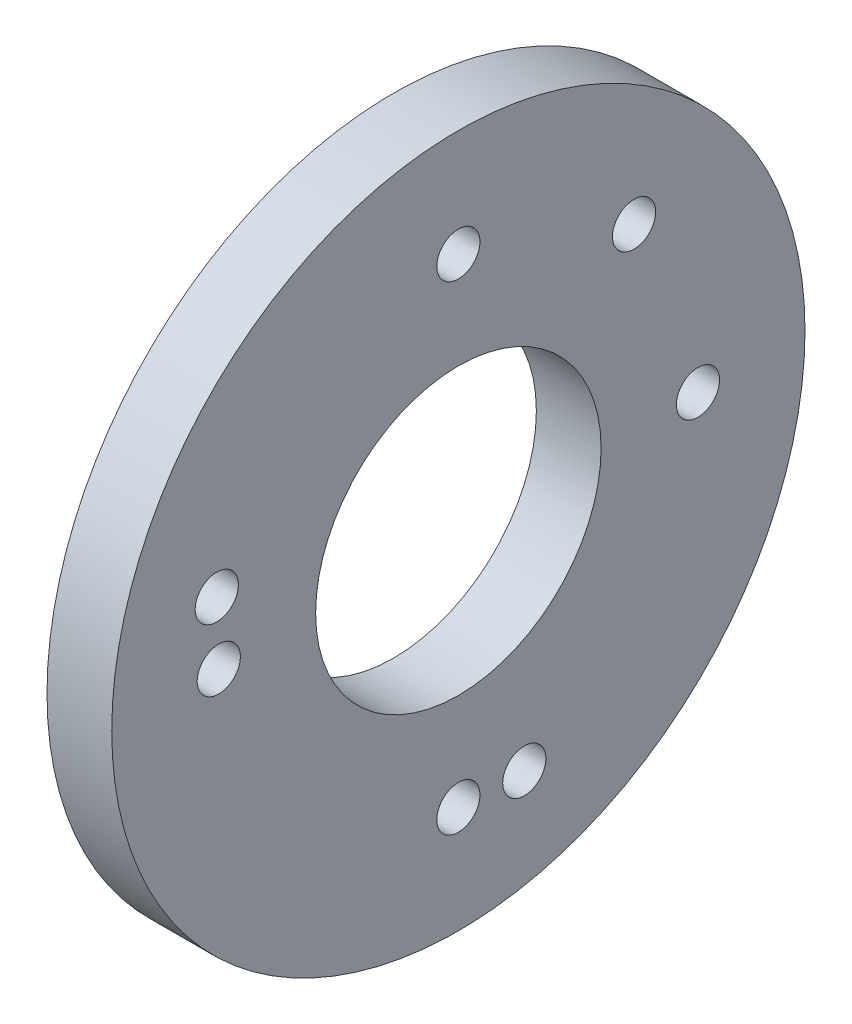
ISO-10303-21;
HEADER;
FILE_DESCRIPTION(('STEP AP214'),'2;1');
FILE_NAME('part.step','',(''),(''),'','','');
FILE_SCHEMA(('AUTOMOTIVE_DESIGN { 1 0 10303 214 1 1 1 1 }'));
ENDSEC;
DATA;
#1=APPLICATION_CONTEXT('core data for automotive mechanical design processes');
#2=APPLICATION_PROTOCOL_DEFINITION('international standard','automotive_design',2000,#1);
#3=PRODUCT_CONTEXT('',#1,'mechanical');
#4=PRODUCT('Part','Part','',(#3));
#5=PRODUCT_RELATED_PRODUCT_CATEGORY('part','',(#4));
#6=PRODUCT_DEFINITION_FORMATION('','',#4);
#7=PRODUCT_DEFINITION_CONTEXT('part definition',#1,'design');
#8=PRODUCT_DEFINITION('design','',#6,#7);
#9=PRODUCT_DEFINITION_SHAPE('','',#8);
#10=(LENGTH_UNIT() NAMED_UNIT(*) SI_UNIT(.MILLI.,.METRE.));
#11=(NAMED_UNIT(*) PLANE_ANGLE_UNIT() SI_UNIT($,.RADIAN.));
#12=(NAMED_UNIT(*) SI_UNIT($,.STERADIAN.) SOLID_ANGLE_UNIT());
#13=UNCERTAINTY_MEASURE_WITH_UNIT(LENGTH_MEASURE(1.E-05),#10,'distance_accuracy_value','');
#14=(GEOMETRIC_REPRESENTATION_CONTEXT(3) GLOBAL_UNCERTAINTY_ASSIGNED_CONTEXT((#13)) GLOBAL_UNIT_ASSIGNED_CONTEXT((#10,
#11,#12)) REPRESENTATION_CONTEXT('',''));
#15=CARTESIAN_POINT('',(0.,0.,0.));
#16=DIRECTION('',(0.,0.,1.));
#17=DIRECTION('',(1.,0.,0.));
#18=AXIS2_PLACEMENT_3D('',#15,#16,#17);
#19=CARTESIAN_POINT('',(0.,0.,0.));
#20=DIRECTION('',(1.,0.,0.));
#21=DIRECTION('',(0.,1.,0.));
#22=AXIS2_PLACEMENT_3D('',#19,#20,#21);
#23=PLANE('',#22);
#24=CARTESIAN_POINT('',(0.,23.5,0.));
#25=DIRECTION('',(1.,0.,0.));
#26=DIRECTION('',(0.,1.,0.));
#27=AXIS2_PLACEMENT_3D('',#24,#25,#26);
#28=CIRCLE('',#27,2.117);
#29=CARTESIAN_POINT('',(0.,21.383,0.));
#30=VERTEX_POINT('',#29);
#31=EDGE_CURVE('E136',#30,#30,#28,.T.);
#32=ORIENTED_EDGE('',*,*,#31,.T.);
#33=EDGE_LOOP('',(#32));
#34=FACE_BOUND('',#33,.T.);
#35=CARTESIAN_POINT('',(0.,0.,23.5));
#36=DIRECTION('',(1.,0.,0.));
#37=DIRECTION('',(0.,0.,1.));
#38=AXIS2_PLACEMENT_3D('',#35,#36,#37);
#39=CIRCLE('',#38,2.117);
#40=CARTESIAN_POINT('',(0.,0.,21.383));
#41=VERTEX_POINT('',#40);
#42=EDGE_CURVE('E142',#41,#41,#39,.T.);
#43=ORIENTED_EDGE('',*,*,#42,.T.);
#44=EDGE_LOOP('',(#43));
#45=FACE_BOUND('',#44,.T.);
#46=CARTESIAN_POINT('',(0.,-23.5,0.));
#47=DIRECTION('',(1.,0.,0.));
#48=DIRECTION('',(0.,-1.,0.));
#49=AXIS2_PLACEMENT_3D('',#46,#47,#48);
#50=CIRCLE('',#49,2.117);
#51=CARTESIAN_POINT('',(0.,-21.383,0.));
#52=VERTEX_POINT('',#51);
#53=EDGE_CURVE('E137',#52,#52,#50,.T.);
#54=ORIENTED_EDGE('',*,*,#53,.T.);
#55=EDGE_LOOP('',(#54));
#56=FACE_BOUND('',#55,.T.);
#57=CARTESIAN_POINT('',(0.,0.,-23.5));
#58=DIRECTION('',(1.,0.,0.));
#59=DIRECTION('',(0.,0.,-1.));
#60=AXIS2_PLACEMENT_3D('',#57,#58,#59);
#61=CIRCLE('',#60,2.117);
#62=CARTESIAN_POINT('',(0.,0.,-21.383));
#63=VERTEX_POINT('',#62);
#64=EDGE_CURVE('E129',#63,#63,#61,.T.);
#65=ORIENTED_EDGE('',*,*,#64,.T.);
#66=EDGE_LOOP('',(#65));
#67=FACE_BOUND('',#66,.T.);
#68=CARTESIAN_POINT('',(0.,17.41511596039,-17.2326357846433));
#69=DIRECTION('',(1.,0.,0.));
#70=DIRECTION('',(0.,1.,0.));
#71=AXIS2_PLACEMENT_3D('',#68,#69,#70);
#72=CIRCLE('',#71,2.117);
#73=CARTESIAN_POINT('',(0.,15.29811596039,-17.2326357846433));
#74=VERTEX_POINT('',#73);
#75=EDGE_CURVE('E110',#74,#74,#72,.T.);
#76=ORIENTED_EDGE('',*,*,#75,.T.);
#77=EDGE_LOOP('',(#76));
#78=FACE_BOUND('',#77,.T.);
#79=CARTESIAN_POINT('',(0.,6.21634238347088,23.6982507238712));
#80=DIRECTION('',(1.,0.,0.));
#81=DIRECTION('',(0.,-0.5,0.866025403784439));
#82=AXIS2_PLACEMENT_3D('',#79,#80,#81);
#83=CIRCLE('',#82,2.117);
#84=CARTESIAN_POINT('',(0.,7.27484238347088,21.8648749440596));
#85=VERTEX_POINT('',#84);
#86=EDGE_CURVE('E259',#85,#85,#83,.T.);
#87=ORIENTED_EDGE('',*,*,#86,.T.);
#88=EDGE_LOOP('',(#87));
#89=FACE_BOUND('',#88,.T.);
#90=CARTESIAN_POINT('',(0.,-23.6314583438609,-6.46561493922793));
#91=DIRECTION('',(1.,0.,0.));
#92=DIRECTION('',(0.,-0.5,-0.866025403784438));
#93=AXIS2_PLACEMENT_3D('',#90,#91,#92);
#94=CIRCLE('',#93,2.117);
#95=CARTESIAN_POINT('',(0.,-22.5729583438609,-4.63223915941627));
#96=VERTEX_POINT('',#95);
#97=EDGE_CURVE('E127',#96,#96,#94,.T.);
#98=ORIENTED_EDGE('',*,*,#97,.T.);
#99=EDGE_LOOP('',(#98));
#100=FACE_BOUND('',#99,.T.);
#101=CARTESIAN_POINT('',(0.,0.,0.));
#102=DIRECTION('',(1.,0.,0.));
#103=DIRECTION('',(0.,1.,0.));
#104=AXIS2_PLACEMENT_3D('',#101,#102,#103);
#105=CIRCLE('',#104,14.);
#106=CARTESIAN_POINT('',(0.,-14.,0.));
#107=VERTEX_POINT('',#106);
#108=EDGE_CURVE('E189',#107,#107,#105,.T.);
#109=ORIENTED_EDGE('',*,*,#108,.T.);
#110=EDGE_LOOP('',(#109));
#111=FACE_BOUND('',#110,.T.);
#112=CARTESIAN_POINT('',(0.,0.,0.));
#113=DIRECTION('',(1.,0.,0.));
#114=DIRECTION('',(0.,0.,-1.));
#115=AXIS2_PLACEMENT_3D('',#112,#113,#114);
#116=CIRCLE('',#115,34.);
#117=CARTESIAN_POINT('',(0.,0.,34.));
#118=VERTEX_POINT('',#117);
#119=EDGE_CURVE('E11',#118,#118,#116,.T.);
#120=ORIENTED_EDGE('',*,*,#119,.F.);
#121=EDGE_LOOP('',(#120));
#122=FACE_BOUND('',#121,.T.);
#123=ADVANCED_FACE('F16',(#34,#45,#56,#67,#78,#89,#100,#111,#122),#23,.F.);
#124=CARTESIAN_POINT('',(6.35,0.,0.));
#125=DIRECTION('',(1.,0.,0.));
#126=DIRECTION('',(0.,1.,0.));
#127=AXIS2_PLACEMENT_3D('',#124,#125,#126);
#128=PLANE('',#127);
#129=CARTESIAN_POINT('',(6.35,23.5,0.));
#130=DIRECTION('',(-1.,0.,0.));
#131=DIRECTION('',(0.,1.,0.));
#132=AXIS2_PLACEMENT_3D('',#129,#130,#131);
#133=CIRCLE('',#132,2.117);
#134=CARTESIAN_POINT('',(6.35,21.383,0.));
#135=VERTEX_POINT('',#134);
#136=EDGE_CURVE('E145',#135,#135,#133,.T.);
#137=ORIENTED_EDGE('',*,*,#136,.T.);
#138=EDGE_LOOP('',(#137));
#139=FACE_BOUND('',#138,.T.);
#140=CARTESIAN_POINT('',(6.35,0.,23.5));
#141=DIRECTION('',(-1.,0.,0.));
#142=DIRECTION('',(0.,0.,1.));
#143=AXIS2_PLACEMENT_3D('',#140,#141,#142);
#144=CIRCLE('',#143,2.117);
#145=CARTESIAN_POINT('',(6.35,0.,21.383));
#146=VERTEX_POINT('',#145);
#147=EDGE_CURVE('E140',#146,#146,#144,.T.);
#148=ORIENTED_EDGE('',*,*,#147,.T.);
#149=EDGE_LOOP('',(#148));
#150=FACE_BOUND('',#149,.T.);
#151=CARTESIAN_POINT('',(6.35,-23.5,0.));
#152=DIRECTION('',(-1.,0.,0.));
#153=DIRECTION('',(0.,-1.,0.));
#154=AXIS2_PLACEMENT_3D('',#151,#152,#153);
#155=CIRCLE('',#154,2.117);
#156=CARTESIAN_POINT('',(6.35,-21.383,0.));
#157=VERTEX_POINT('',#156);
#158=EDGE_CURVE('E131',#157,#157,#155,.T.);
#159=ORIENTED_EDGE('',*,*,#158,.T.);
#160=EDGE_LOOP('',(#159));
#161=FACE_BOUND('',#160,.T.);
#162=CARTESIAN_POINT('',(6.35,0.,-23.5));
#163=DIRECTION('',(-1.,0.,0.));
#164=DIRECTION('',(0.,0.,-1.));
#165=AXIS2_PLACEMENT_3D('',#162,#163,#164);
#166=CIRCLE('',#165,2.117);
#167=CARTESIAN_POINT('',(6.35,0.,-21.383));
#168=VERTEX_POINT('',#167);
#169=EDGE_CURVE('E113',#168,#168,#166,.T.);
#170=ORIENTED_EDGE('',*,*,#169,.T.);
#171=EDGE_LOOP('',(#170));
#172=FACE_BOUND('',#171,.T.);
#173=CARTESIAN_POINT('',(6.35,17.41511596039,-17.2326357846433));
#174=DIRECTION('',(-1.,0.,0.));
#175=DIRECTION('',(0.,1.,0.));
#176=AXIS2_PLACEMENT_3D('',#173,#174,#175);
#177=CIRCLE('',#176,2.117);
#178=CARTESIAN_POINT('',(6.35,15.29811596039,-17.2326357846433));
#179=VERTEX_POINT('',#178);
#180=EDGE_CURVE('E123',#179,#179,#177,.T.);
#181=ORIENTED_EDGE('',*,*,#180,.T.);
#182=EDGE_LOOP('',(#181));
#183=FACE_BOUND('',#182,.T.);
#184=CARTESIAN_POINT('',(6.35,6.21634238347088,23.6982507238712));
#185=DIRECTION('',(-1.,0.,0.));
#186=DIRECTION('',(0.,-0.5,0.866025403784439));
#187=AXIS2_PLACEMENT_3D('',#184,#185,#186);
#188=CIRCLE('',#187,2.117);
#189=CARTESIAN_POINT('',(6.35,7.27484238347088,21.8648749440596));
#190=VERTEX_POINT('',#189);
#191=EDGE_CURVE('E147',#190,#190,#188,.T.);
#192=ORIENTED_EDGE('',*,*,#191,.T.);
#193=EDGE_LOOP('',(#192));
#194=FACE_BOUND('',#193,.T.);
#195=CARTESIAN_POINT('',(6.35,-23.6314583438609,-6.46561493922793));
#196=DIRECTION('',(-1.,0.,0.));
#197=DIRECTION('',(0.,-0.5,-0.866025403784439));
#198=AXIS2_PLACEMENT_3D('',#195,#196,#197);
#199=CIRCLE('',#198,2.117);
#200=CARTESIAN_POINT('',(6.35,-22.5729583438609,-4.63223915941627));
#201=VERTEX_POINT('',#200);
#202=EDGE_CURVE('E185',#201,#201,#199,.T.);
#203=ORIENTED_EDGE('',*,*,#202,.T.);
#204=EDGE_LOOP('',(#203));
#205=FACE_BOUND('',#204,.T.);
#206=CARTESIAN_POINT('',(6.35,0.,0.));
#207=DIRECTION('',(-1.,0.,0.));
#208=DIRECTION('',(0.,1.,0.));
#209=AXIS2_PLACEMENT_3D('',#206,#207,#208);
#210=CIRCLE('',#209,14.);
#211=CARTESIAN_POINT('',(6.35,-14.,0.));
#212=VERTEX_POINT('',#211);
#213=EDGE_CURVE('E190',#212,#212,#210,.T.);
#214=ORIENTED_EDGE('',*,*,#213,.T.);
#215=EDGE_LOOP('',(#214));
#216=FACE_BOUND('',#215,.T.);
#217=CARTESIAN_POINT('',(6.35,0.,0.));
#218=DIRECTION('',(1.,0.,0.));
#219=DIRECTION('',(0.,0.,-1.));
#220=AXIS2_PLACEMENT_3D('',#217,#218,#219);
#221=CIRCLE('',#220,34.);
#222=CARTESIAN_POINT('',(6.35,0.,34.));
#223=VERTEX_POINT('',#222);
#224=EDGE_CURVE('E132',#223,#223,#221,.T.);
#225=ORIENTED_EDGE('',*,*,#224,.T.);
#226=EDGE_LOOP('',(#225));
#227=FACE_BOUND('',#226,.T.);
#228=ADVANCED_FACE('F215',(#139,#150,#161,#172,#183,#194,#205,#216,#227),#128,.T.);
#229=CARTESIAN_POINT('',(0.,0.,0.));
#230=DIRECTION('',(1.,0.,0.));
#231=DIRECTION('',(0.,0.,-1.));
#232=AXIS2_PLACEMENT_3D('',#229,#230,#231);
#233=CYLINDRICAL_SURFACE('',#232,34.);
#234=ORIENTED_EDGE('',*,*,#224,.F.);
#235=DIRECTION('',(-1.,0.,0.));
#236=VECTOR('',#235,1.);
#237=CARTESIAN_POINT('',(0.,0.,34.));
#238=LINE('',#237,#236);
#239=EDGE_CURVE('E27',#223,#118,#238,.T.);
#240=ORIENTED_EDGE('',*,*,#239,.T.);
#241=ORIENTED_EDGE('',*,*,#119,.T.);
#242=ORIENTED_EDGE('',*,*,#239,.F.);
#243=EDGE_LOOP('',(#234,#240,#241,#242));
#244=FACE_BOUND('',#243,.T.);
#245=ADVANCED_FACE('F225',(#244),#233,.T.);
#246=CARTESIAN_POINT('',(2.8575,23.5,0.));
#247=DIRECTION('',(-1.,0.,0.));
#248=DIRECTION('',(0.,1.,0.));
#249=AXIS2_PLACEMENT_3D('',#246,#247,#248);
#250=CYLINDRICAL_SURFACE('',#249,2.117);
#251=ORIENTED_EDGE('',*,*,#136,.F.);
#252=DIRECTION('',(-1.,0.,0.));
#253=VECTOR('',#252,1.);
#254=CARTESIAN_POINT('',(2.8575,21.383,0.));
#255=LINE('',#254,#253);
#256=EDGE_CURVE('E155',#135,#30,#255,.T.);
#257=ORIENTED_EDGE('',*,*,#256,.T.);
#258=ORIENTED_EDGE('',*,*,#31,.F.);
#259=ORIENTED_EDGE('',*,*,#256,.F.);
#260=EDGE_LOOP('',(#251,#257,#258,#259));
#261=FACE_BOUND('',#260,.T.);
#262=ADVANCED_FACE('F236',(#261),#250,.F.);
#263=CARTESIAN_POINT('',(2.8575,0.,23.5));
#264=DIRECTION('',(-1.,0.,0.));
#265=DIRECTION('',(0.,0.,1.));
#266=AXIS2_PLACEMENT_3D('',#263,#264,#265);
#267=CYLINDRICAL_SURFACE('',#266,2.117);
#268=ORIENTED_EDGE('',*,*,#147,.F.);
#269=DIRECTION('',(-1.,0.,0.));
#270=VECTOR('',#269,1.);
#271=CARTESIAN_POINT('',(2.8575,0.,21.383));
#272=LINE('',#271,#270);
#273=EDGE_CURVE('E146',#146,#41,#272,.T.);
#274=ORIENTED_EDGE('',*,*,#273,.T.);
#275=ORIENTED_EDGE('',*,*,#42,.F.);
#276=ORIENTED_EDGE('',*,*,#273,.F.);
#277=EDGE_LOOP('',(#268,#274,#275,#276));
#278=FACE_BOUND('',#277,.T.);
#279=ADVANCED_FACE('F211',(#278),#267,.F.);
#280=CARTESIAN_POINT('',(2.8575,-23.5,0.));
#281=DIRECTION('',(-1.,0.,0.));
#282=DIRECTION('',(0.,-1.,0.));
#283=AXIS2_PLACEMENT_3D('',#280,#281,#282);
#284=CYLINDRICAL_SURFACE('',#283,2.117);
#285=ORIENTED_EDGE('',*,*,#158,.F.);
#286=DIRECTION('',(-1.,0.,0.));
#287=VECTOR('',#286,1.);
#288=CARTESIAN_POINT('',(2.8575,-21.383,0.));
#289=LINE('',#288,#287);
#290=EDGE_CURVE('E141',#157,#52,#289,.T.);
#291=ORIENTED_EDGE('',*,*,#290,.T.);
#292=ORIENTED_EDGE('',*,*,#53,.F.);
#293=ORIENTED_EDGE('',*,*,#290,.F.);
#294=EDGE_LOOP('',(#285,#291,#292,#293));
#295=FACE_BOUND('',#294,.T.);
#296=ADVANCED_FACE('F257',(#295),#284,.F.);
#297=CARTESIAN_POINT('',(2.8575,0.,-23.5));
#298=DIRECTION('',(-1.,0.,0.));
#299=DIRECTION('',(0.,0.,-1.));
#300=AXIS2_PLACEMENT_3D('',#297,#298,#299);
#301=CYLINDRICAL_SURFACE('',#300,2.117);
#302=ORIENTED_EDGE('',*,*,#169,.F.);
#303=DIRECTION('',(-1.,0.,0.));
#304=VECTOR('',#303,1.);
#305=CARTESIAN_POINT('',(2.8575,0.,-21.383));
#306=LINE('',#305,#304);
#307=EDGE_CURVE('E120',#168,#63,#306,.T.);
#308=ORIENTED_EDGE('',*,*,#307,.T.);
#309=ORIENTED_EDGE('',*,*,#64,.F.);
#310=ORIENTED_EDGE('',*,*,#307,.F.);
#311=EDGE_LOOP('',(#302,#308,#309,#310));
#312=FACE_BOUND('',#311,.T.);
#313=ADVANCED_FACE('F18',(#312),#301,.F.);
#314=CARTESIAN_POINT('',(3.175,17.41511596039,-17.2326357846433));
#315=DIRECTION('',(-1.,0.,0.));
#316=DIRECTION('',(0.,1.,0.));
#317=AXIS2_PLACEMENT_3D('',#314,#315,#316);
#318=CYLINDRICAL_SURFACE('',#317,2.117);
#319=ORIENTED_EDGE('',*,*,#180,.F.);
#320=DIRECTION('',(-1.,0.,0.));
#321=VECTOR('',#320,1.);
#322=CARTESIAN_POINT('',(3.175,15.29811596039,-17.2326357846433));
#323=LINE('',#322,#321);
#324=EDGE_CURVE('E104',#179,#74,#323,.T.);
#325=ORIENTED_EDGE('',*,*,#324,.T.);
#326=ORIENTED_EDGE('',*,*,#75,.F.);
#327=ORIENTED_EDGE('',*,*,#324,.F.);
#328=EDGE_LOOP('',(#319,#325,#326,#327));
#329=FACE_BOUND('',#328,.T.);
#330=ADVANCED_FACE('F248',(#329),#318,.F.);
#331=CARTESIAN_POINT('',(3.175,6.21634238347088,23.6982507238712));
#332=DIRECTION('',(-1.,0.,0.));
#333=DIRECTION('',(0.,-0.5,0.866025403784439));
#334=AXIS2_PLACEMENT_3D('',#331,#332,#333);
#335=CYLINDRICAL_SURFACE('',#334,2.117);
#336=ORIENTED_EDGE('',*,*,#191,.F.);
#337=DIRECTION('',(-1.,0.,0.));
#338=VECTOR('',#337,1.);
#339=CARTESIAN_POINT('',(3.175,7.27484238347088,21.8648749440596));
#340=LINE('',#339,#338);
#341=EDGE_CURVE('E20',#190,#85,#340,.T.);
#342=ORIENTED_EDGE('',*,*,#341,.T.);
#343=ORIENTED_EDGE('',*,*,#86,.F.);
#344=ORIENTED_EDGE('',*,*,#341,.F.);
#345=EDGE_LOOP('',(#336,#342,#343,#344));
#346=FACE_BOUND('',#345,.T.);
#347=ADVANCED_FACE('F250',(#346),#335,.F.);
#348=CARTESIAN_POINT('',(3.175,-23.6314583438609,-6.46561493922793));
#349=DIRECTION('',(-1.,0.,0.));
#350=DIRECTION('',(0.,-0.5,-0.866025403784439));
#351=AXIS2_PLACEMENT_3D('',#348,#349,#350);
#352=CYLINDRICAL_SURFACE('',#351,2.117);
#353=ORIENTED_EDGE('',*,*,#202,.F.);
#354=DIRECTION('',(-1.,0.,0.));
#355=VECTOR('',#354,1.);
#356=CARTESIAN_POINT('',(3.175,-22.5729583438609,-4.63223915941627));
#357=LINE('',#356,#355);
#358=EDGE_CURVE('E188',#201,#96,#357,.T.);
#359=ORIENTED_EDGE('',*,*,#358,.T.);
#360=ORIENTED_EDGE('',*,*,#97,.F.);
#361=ORIENTED_EDGE('',*,*,#358,.F.);
#362=EDGE_LOOP('',(#353,#359,#360,#361));
#363=FACE_BOUND('',#362,.T.);
#364=ADVANCED_FACE('F246',(#363),#352,.F.);
#365=CARTESIAN_POINT('',(2.8575,0.,0.));
#366=DIRECTION('',(-1.,0.,0.));
#367=DIRECTION('',(0.,1.,0.));
#368=AXIS2_PLACEMENT_3D('',#365,#366,#367);
#369=CYLINDRICAL_SURFACE('',#368,14.);
#370=ORIENTED_EDGE('',*,*,#213,.F.);
#371=DIRECTION('',(-1.,0.,0.));
#372=VECTOR('',#371,1.);
#373=CARTESIAN_POINT('',(2.8575,-14.,0.));
#374=LINE('',#373,#372);
#375=EDGE_CURVE('E194',#212,#107,#374,.T.);
#376=ORIENTED_EDGE('',*,*,#375,.T.);
#377=ORIENTED_EDGE('',*,*,#108,.F.);
#378=ORIENTED_EDGE('',*,*,#375,.F.);
#379=EDGE_LOOP('',(#370,#376,#377,#378));
#380=FACE_BOUND('',#379,.T.);
#381=ADVANCED_FACE('F243',(#380),#369,.F.);
#382=CLOSED_SHELL('',(#123,#228,#245,#262,#279,#296,#313,#330,#347,#364,#381));
#383=MANIFOLD_SOLID_BREP('B1',#382);
#384=ADVANCED_BREP_SHAPE_REPRESENTATION('',(#18,#383),#14);
#385=SHAPE_DEFINITION_REPRESENTATION(#9,#384);
ENDSEC;
END-ISO-10303-21;
